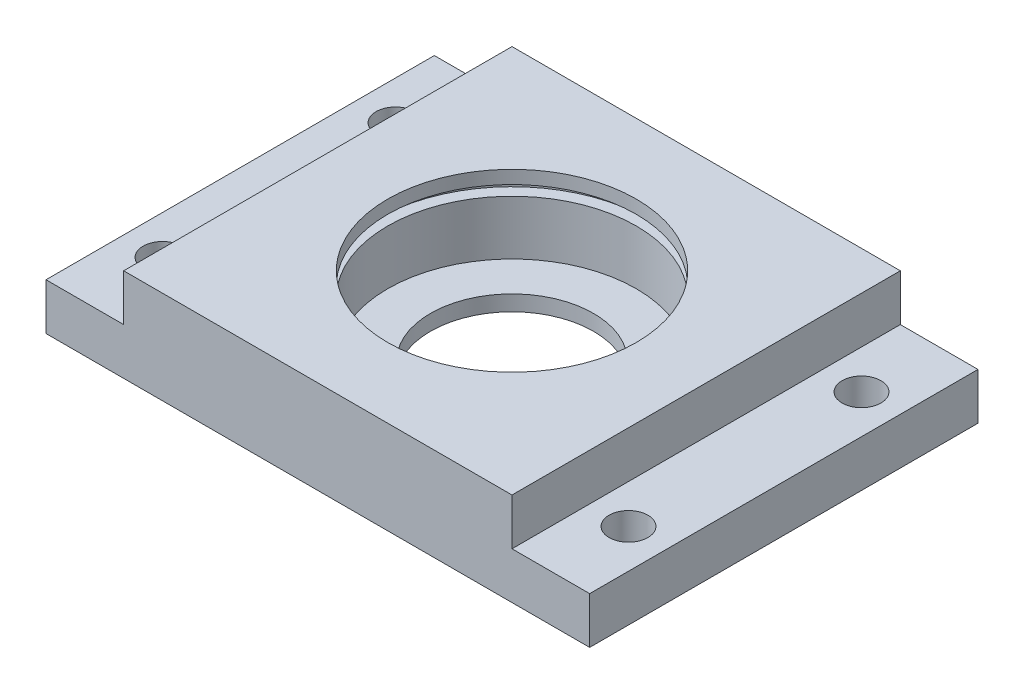
ISO-10303-21;
HEADER;
FILE_DESCRIPTION(('STEP AP214'),'2;1');
FILE_NAME('part.step','',(''),(''),'','','');
FILE_SCHEMA(('AUTOMOTIVE_DESIGN { 1 0 10303 214 1 1 1 1 }'));
ENDSEC;
DATA;
#1=APPLICATION_CONTEXT('core data for automotive mechanical design processes');
#2=APPLICATION_PROTOCOL_DEFINITION('international standard','automotive_design',2000,#1);
#3=PRODUCT_CONTEXT('',#1,'mechanical');
#4=PRODUCT('Part','Part','',(#3));
#5=PRODUCT_RELATED_PRODUCT_CATEGORY('part','',(#4));
#6=PRODUCT_DEFINITION_FORMATION('','',#4);
#7=PRODUCT_DEFINITION_CONTEXT('part definition',#1,'design');
#8=PRODUCT_DEFINITION('design','',#6,#7);
#9=PRODUCT_DEFINITION_SHAPE('','',#8);
#10=(LENGTH_UNIT() NAMED_UNIT(*) SI_UNIT(.MILLI.,.METRE.));
#11=(NAMED_UNIT(*) PLANE_ANGLE_UNIT() SI_UNIT($,.RADIAN.));
#12=(NAMED_UNIT(*) SI_UNIT($,.STERADIAN.) SOLID_ANGLE_UNIT());
#13=UNCERTAINTY_MEASURE_WITH_UNIT(LENGTH_MEASURE(1.E-05),#10,'distance_accuracy_value','');
#14=(GEOMETRIC_REPRESENTATION_CONTEXT(3) GLOBAL_UNCERTAINTY_ASSIGNED_CONTEXT((#13)) GLOBAL_UNIT_ASSIGNED_CONTEXT((#10,
#11,#12)) REPRESENTATION_CONTEXT('',''));
#15=CARTESIAN_POINT('',(0.,0.,0.));
#16=DIRECTION('',(0.,0.,1.));
#17=DIRECTION('',(1.,0.,0.));
#18=AXIS2_PLACEMENT_3D('',#15,#16,#17);
#19=CARTESIAN_POINT('',(25.,12.,-25.));
#20=DIRECTION('',(-1.,0.,0.));
#21=DIRECTION('',(0.,0.,1.));
#22=AXIS2_PLACEMENT_3D('',#19,#20,#21);
#23=PLANE('',#22);
#24=DIRECTION('',(0.,0.,1.));
#25=VECTOR('',#24,1.);
#26=CARTESIAN_POINT('',(25.,6.,-25.));
#27=LINE('',#26,#25);
#28=CARTESIAN_POINT('',(25.,6.,-25.));
#29=VERTEX_POINT('',#28);
#30=CARTESIAN_POINT('',(25.,6.,25.));
#31=VERTEX_POINT('',#30);
#32=EDGE_CURVE('E50',#29,#31,#27,.T.);
#33=ORIENTED_EDGE('',*,*,#32,.F.);
#34=DIRECTION('',(0.,-1.,0.));
#35=VECTOR('',#34,1.);
#36=CARTESIAN_POINT('',(25.,12.,-25.));
#37=LINE('',#36,#35);
#38=CARTESIAN_POINT('',(25.,12.,-25.));
#39=VERTEX_POINT('',#38);
#40=EDGE_CURVE('E123',#39,#29,#37,.T.);
#41=ORIENTED_EDGE('',*,*,#40,.F.);
#42=DIRECTION('',(0.,0.,-1.));
#43=VECTOR('',#42,1.);
#44=CARTESIAN_POINT('',(25.,12.,-25.));
#45=LINE('',#44,#43);
#46=CARTESIAN_POINT('',(25.,12.,25.));
#47=VERTEX_POINT('',#46);
#48=EDGE_CURVE('E205',#47,#39,#45,.T.);
#49=ORIENTED_EDGE('',*,*,#48,.F.);
#50=DIRECTION('',(0.,-1.,0.));
#51=VECTOR('',#50,1.);
#52=CARTESIAN_POINT('',(25.,12.,25.));
#53=LINE('',#52,#51);
#54=EDGE_CURVE('E42',#47,#31,#53,.T.);
#55=ORIENTED_EDGE('',*,*,#54,.T.);
#56=EDGE_LOOP('',(#33,#41,#49,#55));
#57=FACE_BOUND('',#56,.T.);
#58=ADVANCED_FACE('F33',(#57),#23,.F.);
#59=CARTESIAN_POINT('',(-25.,12.,-25.));
#60=DIRECTION('',(1.,0.,0.));
#61=DIRECTION('',(0.,0.,-1.));
#62=AXIS2_PLACEMENT_3D('',#59,#60,#61);
#63=PLANE('',#62);
#64=DIRECTION('',(0.,0.,-1.));
#65=VECTOR('',#64,1.);
#66=CARTESIAN_POINT('',(-25.,6.,-25.));
#67=LINE('',#66,#65);
#68=CARTESIAN_POINT('',(-25.,6.,25.));
#69=VERTEX_POINT('',#68);
#70=CARTESIAN_POINT('',(-25.,6.,-25.));
#71=VERTEX_POINT('',#70);
#72=EDGE_CURVE('E58',#69,#71,#67,.T.);
#73=ORIENTED_EDGE('',*,*,#72,.F.);
#74=DIRECTION('',(0.,-1.,0.));
#75=VECTOR('',#74,1.);
#76=CARTESIAN_POINT('',(-25.,12.,25.));
#77=LINE('',#76,#75);
#78=CARTESIAN_POINT('',(-25.,12.,25.));
#79=VERTEX_POINT('',#78);
#80=EDGE_CURVE('E11',#79,#69,#77,.T.);
#81=ORIENTED_EDGE('',*,*,#80,.F.);
#82=DIRECTION('',(0.,0.,1.));
#83=VECTOR('',#82,1.);
#84=CARTESIAN_POINT('',(-25.,12.,-25.));
#85=LINE('',#84,#83);
#86=CARTESIAN_POINT('',(-25.,12.,-25.));
#87=VERTEX_POINT('',#86);
#88=EDGE_CURVE('E199',#87,#79,#85,.T.);
#89=ORIENTED_EDGE('',*,*,#88,.F.);
#90=DIRECTION('',(0.,-1.,0.));
#91=VECTOR('',#90,1.);
#92=CARTESIAN_POINT('',(-25.,12.,-25.));
#93=LINE('',#92,#91);
#94=EDGE_CURVE('E155',#87,#71,#93,.T.);
#95=ORIENTED_EDGE('',*,*,#94,.T.);
#96=EDGE_LOOP('',(#73,#81,#89,#95));
#97=FACE_BOUND('',#96,.T.);
#98=ADVANCED_FACE('F35',(#97),#63,.F.);
#99=CARTESIAN_POINT('',(0.,2.,0.));
#100=DIRECTION('',(0.,1.,0.));
#101=DIRECTION('',(0.,0.,1.));
#102=AXIS2_PLACEMENT_3D('',#99,#100,#101);
#103=CYLINDRICAL_SURFACE('',#102,16.);
#104=CARTESIAN_POINT('',(0.,12.,0.));
#105=DIRECTION('',(0.,1.,0.));
#106=DIRECTION('',(0.,0.,1.));
#107=AXIS2_PLACEMENT_3D('',#104,#105,#106);
#108=CIRCLE('',#107,16.);
#109=CARTESIAN_POINT('',(0.,12.,16.));
#110=VERTEX_POINT('',#109);
#111=EDGE_CURVE('E177',#110,#110,#108,.T.);
#112=ORIENTED_EDGE('',*,*,#111,.T.);
#113=EDGE_LOOP('',(#112));
#114=FACE_BOUND('',#113,.T.);
#115=CARTESIAN_POINT('',(0.,10.3,0.));
#116=DIRECTION('',(0.,-1.,0.));
#117=DIRECTION('',(0.,0.,-1.));
#118=AXIS2_PLACEMENT_3D('',#115,#116,#117);
#119=CIRCLE('',#118,16.);
#120=CARTESIAN_POINT('',(0.,10.3,-16.));
#121=VERTEX_POINT('',#120);
#122=EDGE_CURVE('E175',#121,#121,#119,.F.);
#123=ORIENTED_EDGE('',*,*,#122,.F.);
#124=EDGE_LOOP('',(#123));
#125=FACE_BOUND('',#124,.T.);
#126=ADVANCED_FACE('F232',(#114,#125),#103,.F.);
#127=CARTESIAN_POINT('',(25.,12.,25.));
#128=DIRECTION('',(0.,0.,-1.));
#129=DIRECTION('',(-1.,0.,0.));
#130=AXIS2_PLACEMENT_3D('',#127,#128,#129);
#131=PLANE('',#130);
#132=DIRECTION('',(1.,0.,0.));
#133=VECTOR('',#132,1.);
#134=CARTESIAN_POINT('',(25.,0.,25.));
#135=LINE('',#134,#133);
#136=CARTESIAN_POINT('',(-35.,0.,25.));
#137=VERTEX_POINT('',#136);
#138=CARTESIAN_POINT('',(35.,0.,25.));
#139=VERTEX_POINT('',#138);
#140=EDGE_CURVE('E197',#137,#139,#135,.T.);
#141=ORIENTED_EDGE('',*,*,#140,.T.);
#142=DIRECTION('',(0.,-1.,0.));
#143=VECTOR('',#142,1.);
#144=CARTESIAN_POINT('',(35.,0.,25.));
#145=LINE('',#144,#143);
#146=CARTESIAN_POINT('',(35.,6.,25.));
#147=VERTEX_POINT('',#146);
#148=EDGE_CURVE('E111',#147,#139,#145,.T.);
#149=ORIENTED_EDGE('',*,*,#148,.F.);
#150=DIRECTION('',(-1.,0.,0.));
#151=VECTOR('',#150,1.);
#152=CARTESIAN_POINT('',(35.,6.,25.));
#153=LINE('',#152,#151);
#154=EDGE_CURVE('E107',#147,#31,#153,.T.);
#155=ORIENTED_EDGE('',*,*,#154,.T.);
#156=ORIENTED_EDGE('',*,*,#54,.F.);
#157=DIRECTION('',(1.,0.,0.));
#158=VECTOR('',#157,1.);
#159=CARTESIAN_POINT('',(25.,12.,25.));
#160=LINE('',#159,#158);
#161=EDGE_CURVE('E202',#79,#47,#160,.T.);
#162=ORIENTED_EDGE('',*,*,#161,.F.);
#163=ORIENTED_EDGE('',*,*,#80,.T.);
#164=DIRECTION('',(1.,0.,0.));
#165=VECTOR('',#164,1.);
#166=CARTESIAN_POINT('',(-35.,6.,25.));
#167=LINE('',#166,#165);
#168=CARTESIAN_POINT('',(-35.,6.,25.));
#169=VERTEX_POINT('',#168);
#170=EDGE_CURVE('E159',#169,#69,#167,.T.);
#171=ORIENTED_EDGE('',*,*,#170,.F.);
#172=DIRECTION('',(0.,1.,0.));
#173=VECTOR('',#172,1.);
#174=CARTESIAN_POINT('',(-35.,0.,25.));
#175=LINE('',#174,#173);
#176=EDGE_CURVE('E144',#137,#169,#175,.T.);
#177=ORIENTED_EDGE('',*,*,#176,.F.);
#178=EDGE_LOOP('',(#141,#149,#155,#156,#162,#163,#171,#177));
#179=FACE_BOUND('',#178,.T.);
#180=ADVANCED_FACE('F235',(#179),#131,.F.);
#181=CARTESIAN_POINT('',(25.,12.,-25.));
#182=DIRECTION('',(0.,0.,1.));
#183=DIRECTION('',(1.,0.,0.));
#184=AXIS2_PLACEMENT_3D('',#181,#182,#183);
#185=PLANE('',#184);
#186=DIRECTION('',(-1.,0.,0.));
#187=VECTOR('',#186,1.);
#188=CARTESIAN_POINT('',(25.,0.,-25.));
#189=LINE('',#188,#187);
#190=CARTESIAN_POINT('',(35.,0.,-25.));
#191=VERTEX_POINT('',#190);
#192=CARTESIAN_POINT('',(-35.,0.,-25.));
#193=VERTEX_POINT('',#192);
#194=EDGE_CURVE('E203',#191,#193,#189,.T.);
#195=ORIENTED_EDGE('',*,*,#194,.T.);
#196=DIRECTION('',(0.,-1.,0.));
#197=VECTOR('',#196,1.);
#198=CARTESIAN_POINT('',(-35.,0.,-25.));
#199=LINE('',#198,#197);
#200=CARTESIAN_POINT('',(-35.,6.,-25.));
#201=VERTEX_POINT('',#200);
#202=EDGE_CURVE('E124',#201,#193,#199,.T.);
#203=ORIENTED_EDGE('',*,*,#202,.F.);
#204=DIRECTION('',(1.,0.,0.));
#205=VECTOR('',#204,1.);
#206=CARTESIAN_POINT('',(-35.,6.,-25.));
#207=LINE('',#206,#205);
#208=EDGE_CURVE('E148',#201,#71,#207,.T.);
#209=ORIENTED_EDGE('',*,*,#208,.T.);
#210=ORIENTED_EDGE('',*,*,#94,.F.);
#211=DIRECTION('',(-1.,0.,0.));
#212=VECTOR('',#211,1.);
#213=CARTESIAN_POINT('',(25.,12.,-25.));
#214=LINE('',#213,#212);
#215=EDGE_CURVE('E207',#39,#87,#214,.T.);
#216=ORIENTED_EDGE('',*,*,#215,.F.);
#217=ORIENTED_EDGE('',*,*,#40,.T.);
#218=DIRECTION('',(-1.,0.,0.));
#219=VECTOR('',#218,1.);
#220=CARTESIAN_POINT('',(35.,6.,-25.));
#221=LINE('',#220,#219);
#222=CARTESIAN_POINT('',(35.,6.,-25.));
#223=VERTEX_POINT('',#222);
#224=EDGE_CURVE('E105',#223,#29,#221,.T.);
#225=ORIENTED_EDGE('',*,*,#224,.F.);
#226=DIRECTION('',(0.,1.,0.));
#227=VECTOR('',#226,1.);
#228=CARTESIAN_POINT('',(35.,0.,-25.));
#229=LINE('',#228,#227);
#230=EDGE_CURVE('E112',#191,#223,#229,.T.);
#231=ORIENTED_EDGE('',*,*,#230,.F.);
#232=EDGE_LOOP('',(#195,#203,#209,#210,#216,#217,#225,#231));
#233=FACE_BOUND('',#232,.T.);
#234=ADVANCED_FACE('F121',(#233),#185,.F.);
#235=CARTESIAN_POINT('',(0.,12.,0.));
#236=DIRECTION('',(0.,-1.,0.));
#237=DIRECTION('',(0.,0.,-1.));
#238=AXIS2_PLACEMENT_3D('',#235,#236,#237);
#239=PLANE('',#238);
#240=ORIENTED_EDGE('',*,*,#111,.F.);
#241=EDGE_LOOP('',(#240));
#242=FACE_BOUND('',#241,.T.);
#243=ORIENTED_EDGE('',*,*,#88,.T.);
#244=ORIENTED_EDGE('',*,*,#161,.T.);
#245=ORIENTED_EDGE('',*,*,#48,.T.);
#246=ORIENTED_EDGE('',*,*,#215,.T.);
#247=EDGE_LOOP('',(#243,#244,#245,#246));
#248=FACE_BOUND('',#247,.T.);
#249=ADVANCED_FACE('F224',(#242,#248),#239,.F.);
#250=CARTESIAN_POINT('',(0.,0.,0.));
#251=DIRECTION('',(0.,-1.,0.));
#252=DIRECTION('',(0.,0.,-1.));
#253=AXIS2_PLACEMENT_3D('',#250,#251,#252);
#254=PLANE('',#253);
#255=CARTESIAN_POINT('',(30.,0.,-14.9999999999999));
#256=DIRECTION('',(0.,-1.,0.));
#257=DIRECTION('',(0.,0.,-1.));
#258=AXIS2_PLACEMENT_3D('',#255,#256,#257);
#259=CIRCLE('',#258,2.5);
#260=CARTESIAN_POINT('',(30.,0.,-17.5));
#261=VERTEX_POINT('',#260);
#262=EDGE_CURVE('E263',#261,#261,#259,.T.);
#263=ORIENTED_EDGE('',*,*,#262,.F.);
#264=EDGE_LOOP('',(#263));
#265=FACE_BOUND('',#264,.T.);
#266=CARTESIAN_POINT('',(30.,0.,15.0000000000001));
#267=DIRECTION('',(0.,-1.,0.));
#268=DIRECTION('',(0.,0.,-1.));
#269=AXIS2_PLACEMENT_3D('',#266,#267,#268);
#270=CIRCLE('',#269,2.5);
#271=CARTESIAN_POINT('',(30.,0.,12.5000000000001));
#272=VERTEX_POINT('',#271);
#273=EDGE_CURVE('E257',#272,#272,#270,.T.);
#274=ORIENTED_EDGE('',*,*,#273,.F.);
#275=EDGE_LOOP('',(#274));
#276=FACE_BOUND('',#275,.T.);
#277=CARTESIAN_POINT('',(-30.,0.,15.));
#278=DIRECTION('',(0.,-1.,0.));
#279=DIRECTION('',(0.,0.,-1.));
#280=AXIS2_PLACEMENT_3D('',#277,#278,#279);
#281=CIRCLE('',#280,2.5);
#282=CARTESIAN_POINT('',(-30.,0.,12.5));
#283=VERTEX_POINT('',#282);
#284=EDGE_CURVE('E251',#283,#283,#281,.T.);
#285=ORIENTED_EDGE('',*,*,#284,.F.);
#286=EDGE_LOOP('',(#285));
#287=FACE_BOUND('',#286,.T.);
#288=CARTESIAN_POINT('',(-30.,0.,-15.));
#289=DIRECTION('',(0.,-1.,0.));
#290=DIRECTION('',(0.,0.,-1.));
#291=AXIS2_PLACEMENT_3D('',#288,#289,#290);
#292=CIRCLE('',#291,2.5);
#293=CARTESIAN_POINT('',(-30.,0.,-17.5));
#294=VERTEX_POINT('',#293);
#295=EDGE_CURVE('E132',#294,#294,#292,.T.);
#296=ORIENTED_EDGE('',*,*,#295,.F.);
#297=EDGE_LOOP('',(#296));
#298=FACE_BOUND('',#297,.T.);
#299=CARTESIAN_POINT('',(0.,0.,0.));
#300=DIRECTION('',(0.,-1.,0.));
#301=DIRECTION('',(0.,0.,-1.));
#302=AXIS2_PLACEMENT_3D('',#299,#300,#301);
#303=CIRCLE('',#302,10.5);
#304=CARTESIAN_POINT('',(0.,0.,-10.5));
#305=VERTEX_POINT('',#304);
#306=EDGE_CURVE('E193',#305,#305,#303,.T.);
#307=ORIENTED_EDGE('',*,*,#306,.F.);
#308=EDGE_LOOP('',(#307));
#309=FACE_BOUND('',#308,.T.);
#310=ORIENTED_EDGE('',*,*,#140,.F.);
#311=DIRECTION('',(0.,0.,1.));
#312=VECTOR('',#311,1.);
#313=CARTESIAN_POINT('',(-35.,0.,-25.));
#314=LINE('',#313,#312);
#315=EDGE_CURVE('E141',#193,#137,#314,.T.);
#316=ORIENTED_EDGE('',*,*,#315,.F.);
#317=ORIENTED_EDGE('',*,*,#194,.F.);
#318=DIRECTION('',(0.,0.,-1.));
#319=VECTOR('',#318,1.);
#320=CARTESIAN_POINT('',(35.,0.,-25.));
#321=LINE('',#320,#319);
#322=EDGE_CURVE('E118',#139,#191,#321,.T.);
#323=ORIENTED_EDGE('',*,*,#322,.F.);
#324=EDGE_LOOP('',(#310,#316,#317,#323));
#325=FACE_BOUND('',#324,.T.);
#326=ADVANCED_FACE('F212',(#265,#276,#287,#298,#309,#325),#254,.T.);
#327=CARTESIAN_POINT('',(-17.5,10.3,0.));
#328=DIRECTION('',(0.,-1.,0.));
#329=DIRECTION('',(0.,0.,-1.));
#330=AXIS2_PLACEMENT_3D('',#327,#328,#329);
#331=PLANE('',#330);
#332=CARTESIAN_POINT('',(0.,10.3,0.));
#333=DIRECTION('',(0.,-1.,0.));
#334=DIRECTION('',(0.,0.,-1.));
#335=AXIS2_PLACEMENT_3D('',#332,#333,#334);
#336=CIRCLE('',#335,17.5);
#337=CARTESIAN_POINT('',(0.,10.3,-17.5));
#338=VERTEX_POINT('',#337);
#339=EDGE_CURVE('E184',#338,#338,#336,.T.);
#340=ORIENTED_EDGE('',*,*,#339,.T.);
#341=EDGE_LOOP('',(#340));
#342=FACE_BOUND('',#341,.T.);
#343=ORIENTED_EDGE('',*,*,#122,.T.);
#344=EDGE_LOOP('',(#343));
#345=FACE_BOUND('',#344,.T.);
#346=ADVANCED_FACE('F310',(#342,#345),#331,.T.);
#347=CARTESIAN_POINT('',(-16.,9.,0.));
#348=DIRECTION('',(0.,1.,0.));
#349=DIRECTION('',(0.,0.,1.));
#350=AXIS2_PLACEMENT_3D('',#347,#348,#349);
#351=PLANE('',#350);
#352=CARTESIAN_POINT('',(0.,9.,0.));
#353=DIRECTION('',(0.,-1.,0.));
#354=DIRECTION('',(0.,0.,-1.));
#355=AXIS2_PLACEMENT_3D('',#352,#353,#354);
#356=CIRCLE('',#355,17.5);
#357=CARTESIAN_POINT('',(0.,9.,-17.5));
#358=VERTEX_POINT('',#357);
#359=EDGE_CURVE('E188',#358,#358,#356,.T.);
#360=ORIENTED_EDGE('',*,*,#359,.F.);
#361=EDGE_LOOP('',(#360));
#362=FACE_BOUND('',#361,.T.);
#363=CARTESIAN_POINT('',(0.,9.,0.));
#364=DIRECTION('',(0.,1.,0.));
#365=DIRECTION('',(0.,0.,1.));
#366=AXIS2_PLACEMENT_3D('',#363,#364,#365);
#367=CIRCLE('',#366,16.);
#368=CARTESIAN_POINT('',(0.,9.,16.));
#369=VERTEX_POINT('',#368);
#370=EDGE_CURVE('E173',#369,#369,#367,.F.);
#371=ORIENTED_EDGE('',*,*,#370,.T.);
#372=EDGE_LOOP('',(#371));
#373=FACE_BOUND('',#372,.T.);
#374=ADVANCED_FACE('F306',(#362,#373),#351,.T.);
#375=CARTESIAN_POINT('',(0.,2.,0.));
#376=DIRECTION('',(0.,-1.,0.));
#377=DIRECTION('',(0.,0.,-1.));
#378=AXIS2_PLACEMENT_3D('',#375,#376,#377);
#379=CYLINDRICAL_SURFACE('',#378,17.5);
#380=ORIENTED_EDGE('',*,*,#359,.T.);
#381=EDGE_LOOP('',(#380));
#382=FACE_BOUND('',#381,.T.);
#383=ORIENTED_EDGE('',*,*,#339,.F.);
#384=EDGE_LOOP('',(#383));
#385=FACE_BOUND('',#384,.T.);
#386=ADVANCED_FACE('F309',(#382,#385),#379,.F.);
#387=CARTESIAN_POINT('',(0.,2.,0.));
#388=DIRECTION('',(0.,1.,0.));
#389=DIRECTION('',(0.,0.,1.));
#390=AXIS2_PLACEMENT_3D('',#387,#388,#389);
#391=PLANE('',#390);
#392=CARTESIAN_POINT('',(0.,2.,0.));
#393=DIRECTION('',(0.,1.,0.));
#394=DIRECTION('',(0.,0.,1.));
#395=AXIS2_PLACEMENT_3D('',#392,#393,#394);
#396=CIRCLE('',#395,10.5);
#397=CARTESIAN_POINT('',(0.,2.,10.5));
#398=VERTEX_POINT('',#397);
#399=EDGE_CURVE('E151',#398,#398,#396,.T.);
#400=ORIENTED_EDGE('',*,*,#399,.F.);
#401=EDGE_LOOP('',(#400));
#402=FACE_BOUND('',#401,.T.);
#403=CARTESIAN_POINT('',(0.,2.,0.));
#404=DIRECTION('',(0.,1.,0.));
#405=DIRECTION('',(0.,0.,1.));
#406=AXIS2_PLACEMENT_3D('',#403,#404,#405);
#407=CIRCLE('',#406,16.);
#408=CARTESIAN_POINT('',(0.,2.,16.));
#409=VERTEX_POINT('',#408);
#410=EDGE_CURVE('E181',#409,#409,#407,.T.);
#411=ORIENTED_EDGE('',*,*,#410,.T.);
#412=EDGE_LOOP('',(#411));
#413=FACE_BOUND('',#412,.T.);
#414=ADVANCED_FACE('F314',(#402,#413),#391,.T.);
#415=ORIENTED_EDGE('',*,*,#410,.F.);
#416=EDGE_LOOP('',(#415));
#417=FACE_BOUND('',#416,.T.);
#418=ORIENTED_EDGE('',*,*,#370,.F.);
#419=EDGE_LOOP('',(#418));
#420=FACE_BOUND('',#419,.T.);
#421=ADVANCED_FACE('F244',(#417,#420),#103,.F.);
#422=CARTESIAN_POINT('',(0.,-8.,0.));
#423=DIRECTION('',(0.,1.,0.));
#424=DIRECTION('',(0.,0.,1.));
#425=AXIS2_PLACEMENT_3D('',#422,#423,#424);
#426=CYLINDRICAL_SURFACE('',#425,10.5);
#427=ORIENTED_EDGE('',*,*,#306,.T.);
#428=EDGE_LOOP('',(#427));
#429=FACE_BOUND('',#428,.T.);
#430=ORIENTED_EDGE('',*,*,#399,.T.);
#431=EDGE_LOOP('',(#430));
#432=FACE_BOUND('',#431,.T.);
#433=ADVANCED_FACE('F301',(#429,#432),#426,.F.);
#434=CARTESIAN_POINT('',(-35.,6.,-25.));
#435=DIRECTION('',(0.,-1.,0.));
#436=DIRECTION('',(0.,0.,-1.));
#437=AXIS2_PLACEMENT_3D('',#434,#435,#436);
#438=PLANE('',#437);
#439=CARTESIAN_POINT('',(-30.,6.,15.));
#440=DIRECTION('',(0.,1.,0.));
#441=DIRECTION('',(0.,0.,-1.));
#442=AXIS2_PLACEMENT_3D('',#439,#440,#441);
#443=CIRCLE('',#442,2.5);
#444=CARTESIAN_POINT('',(-30.,6.,12.5));
#445=VERTEX_POINT('',#444);
#446=EDGE_CURVE('E254',#445,#445,#443,.T.);
#447=ORIENTED_EDGE('',*,*,#446,.F.);
#448=EDGE_LOOP('',(#447));
#449=FACE_BOUND('',#448,.T.);
#450=CARTESIAN_POINT('',(-30.,6.,-15.));
#451=DIRECTION('',(0.,1.,0.));
#452=DIRECTION('',(0.,0.,1.));
#453=AXIS2_PLACEMENT_3D('',#450,#451,#452);
#454=CIRCLE('',#453,2.5);
#455=CARTESIAN_POINT('',(-30.,6.,-12.5));
#456=VERTEX_POINT('',#455);
#457=EDGE_CURVE('E248',#456,#456,#454,.T.);
#458=ORIENTED_EDGE('',*,*,#457,.F.);
#459=EDGE_LOOP('',(#458));
#460=FACE_BOUND('',#459,.T.);
#461=ORIENTED_EDGE('',*,*,#72,.T.);
#462=ORIENTED_EDGE('',*,*,#208,.F.);
#463=DIRECTION('',(0.,0.,-1.));
#464=VECTOR('',#463,1.);
#465=CARTESIAN_POINT('',(-35.,6.,-25.));
#466=LINE('',#465,#464);
#467=EDGE_CURVE('E146',#169,#201,#466,.T.);
#468=ORIENTED_EDGE('',*,*,#467,.F.);
#469=ORIENTED_EDGE('',*,*,#170,.T.);
#470=EDGE_LOOP('',(#461,#462,#468,#469));
#471=FACE_BOUND('',#470,.T.);
#472=ADVANCED_FACE('F220',(#449,#460,#471),#438,.F.);
#473=CARTESIAN_POINT('',(-35.,0.,0.));
#474=DIRECTION('',(1.,0.,0.));
#475=DIRECTION('',(0.,0.,-1.));
#476=AXIS2_PLACEMENT_3D('',#473,#474,#475);
#477=PLANE('',#476);
#478=ORIENTED_EDGE('',*,*,#202,.T.);
#479=ORIENTED_EDGE('',*,*,#315,.T.);
#480=ORIENTED_EDGE('',*,*,#176,.T.);
#481=ORIENTED_EDGE('',*,*,#467,.T.);
#482=EDGE_LOOP('',(#478,#479,#480,#481));
#483=FACE_BOUND('',#482,.T.);
#484=ADVANCED_FACE('F215',(#483),#477,.F.);
#485=CARTESIAN_POINT('',(35.,6.,-25.));
#486=DIRECTION('',(0.,-1.,0.));
#487=DIRECTION('',(0.,0.,-1.));
#488=AXIS2_PLACEMENT_3D('',#485,#486,#487);
#489=PLANE('',#488);
#490=CARTESIAN_POINT('',(30.,6.,-14.9999999999999));
#491=DIRECTION('',(0.,1.,0.));
#492=DIRECTION('',(0.,0.,-1.));
#493=AXIS2_PLACEMENT_3D('',#490,#491,#492);
#494=CIRCLE('',#493,2.5);
#495=CARTESIAN_POINT('',(30.,6.,-17.5));
#496=VERTEX_POINT('',#495);
#497=EDGE_CURVE('E266',#496,#496,#494,.T.);
#498=ORIENTED_EDGE('',*,*,#497,.F.);
#499=EDGE_LOOP('',(#498));
#500=FACE_BOUND('',#499,.T.);
#501=CARTESIAN_POINT('',(30.,6.,15.0000000000001));
#502=DIRECTION('',(0.,1.,0.));
#503=DIRECTION('',(0.,0.,1.));
#504=AXIS2_PLACEMENT_3D('',#501,#502,#503);
#505=CIRCLE('',#504,2.5);
#506=CARTESIAN_POINT('',(30.,6.,17.5000000000001));
#507=VERTEX_POINT('',#506);
#508=EDGE_CURVE('E260',#507,#507,#505,.T.);
#509=ORIENTED_EDGE('',*,*,#508,.F.);
#510=EDGE_LOOP('',(#509));
#511=FACE_BOUND('',#510,.T.);
#512=ORIENTED_EDGE('',*,*,#32,.T.);
#513=ORIENTED_EDGE('',*,*,#154,.F.);
#514=DIRECTION('',(0.,0.,1.));
#515=VECTOR('',#514,1.);
#516=CARTESIAN_POINT('',(35.,6.,-25.));
#517=LINE('',#516,#515);
#518=EDGE_CURVE('E101',#223,#147,#517,.T.);
#519=ORIENTED_EDGE('',*,*,#518,.F.);
#520=ORIENTED_EDGE('',*,*,#224,.T.);
#521=EDGE_LOOP('',(#512,#513,#519,#520));
#522=FACE_BOUND('',#521,.T.);
#523=ADVANCED_FACE('F103',(#500,#511,#522),#489,.F.);
#524=CARTESIAN_POINT('',(35.,0.,0.));
#525=DIRECTION('',(1.,0.,0.));
#526=DIRECTION('',(0.,0.,-1.));
#527=AXIS2_PLACEMENT_3D('',#524,#525,#526);
#528=PLANE('',#527);
#529=ORIENTED_EDGE('',*,*,#230,.T.);
#530=ORIENTED_EDGE('',*,*,#518,.T.);
#531=ORIENTED_EDGE('',*,*,#148,.T.);
#532=ORIENTED_EDGE('',*,*,#322,.T.);
#533=EDGE_LOOP('',(#529,#530,#531,#532));
#534=FACE_BOUND('',#533,.T.);
#535=ADVANCED_FACE('F116',(#534),#528,.T.);
#536=CARTESIAN_POINT('',(-30.,-4.,-15.));
#537=DIRECTION('',(0.,1.,0.));
#538=DIRECTION('',(0.,0.,1.));
#539=AXIS2_PLACEMENT_3D('',#536,#537,#538);
#540=CYLINDRICAL_SURFACE('',#539,2.5);
#541=ORIENTED_EDGE('',*,*,#295,.T.);
#542=EDGE_LOOP('',(#541));
#543=FACE_BOUND('',#542,.T.);
#544=ORIENTED_EDGE('',*,*,#457,.T.);
#545=EDGE_LOOP('',(#544));
#546=FACE_BOUND('',#545,.T.);
#547=ADVANCED_FACE('F288',(#543,#546),#540,.F.);
#548=CARTESIAN_POINT('',(-30.,-4.,15.));
#549=DIRECTION('',(0.,1.,0.));
#550=DIRECTION('',(0.,0.,1.));
#551=AXIS2_PLACEMENT_3D('',#548,#549,#550);
#552=CYLINDRICAL_SURFACE('',#551,2.5);
#553=ORIENTED_EDGE('',*,*,#284,.T.);
#554=EDGE_LOOP('',(#553));
#555=FACE_BOUND('',#554,.T.);
#556=ORIENTED_EDGE('',*,*,#446,.T.);
#557=EDGE_LOOP('',(#556));
#558=FACE_BOUND('',#557,.T.);
#559=ADVANCED_FACE('F279',(#555,#558),#552,.F.);
#560=CARTESIAN_POINT('',(30.,-4.,15.0000000000001));
#561=DIRECTION('',(0.,1.,0.));
#562=DIRECTION('',(0.,0.,1.));
#563=AXIS2_PLACEMENT_3D('',#560,#561,#562);
#564=CYLINDRICAL_SURFACE('',#563,2.5);
#565=ORIENTED_EDGE('',*,*,#273,.T.);
#566=EDGE_LOOP('',(#565));
#567=FACE_BOUND('',#566,.T.);
#568=ORIENTED_EDGE('',*,*,#508,.T.);
#569=EDGE_LOOP('',(#568));
#570=FACE_BOUND('',#569,.T.);
#571=ADVANCED_FACE('F277',(#567,#570),#564,.F.);
#572=CARTESIAN_POINT('',(30.,-4.,-14.9999999999999));
#573=DIRECTION('',(0.,1.,0.));
#574=DIRECTION('',(0.,0.,1.));
#575=AXIS2_PLACEMENT_3D('',#572,#573,#574);
#576=CYLINDRICAL_SURFACE('',#575,2.5);
#577=ORIENTED_EDGE('',*,*,#262,.T.);
#578=EDGE_LOOP('',(#577));
#579=FACE_BOUND('',#578,.T.);
#580=ORIENTED_EDGE('',*,*,#497,.T.);
#581=EDGE_LOOP('',(#580));
#582=FACE_BOUND('',#581,.T.);
#583=ADVANCED_FACE('F270',(#579,#582),#576,.F.);
#584=CLOSED_SHELL('',(#58,#98,#126,#180,#234,#249,#326,#346,#374,#386,#414,#421,#433,#472,#484,
#523,#535,#547,#559,#571,#583));
#585=MANIFOLD_SOLID_BREP('B2',#584);
#586=ADVANCED_BREP_SHAPE_REPRESENTATION('',(#18,#585),#14);
#587=SHAPE_DEFINITION_REPRESENTATION(#9,#586);
ENDSEC;
END-ISO-10303-21;
